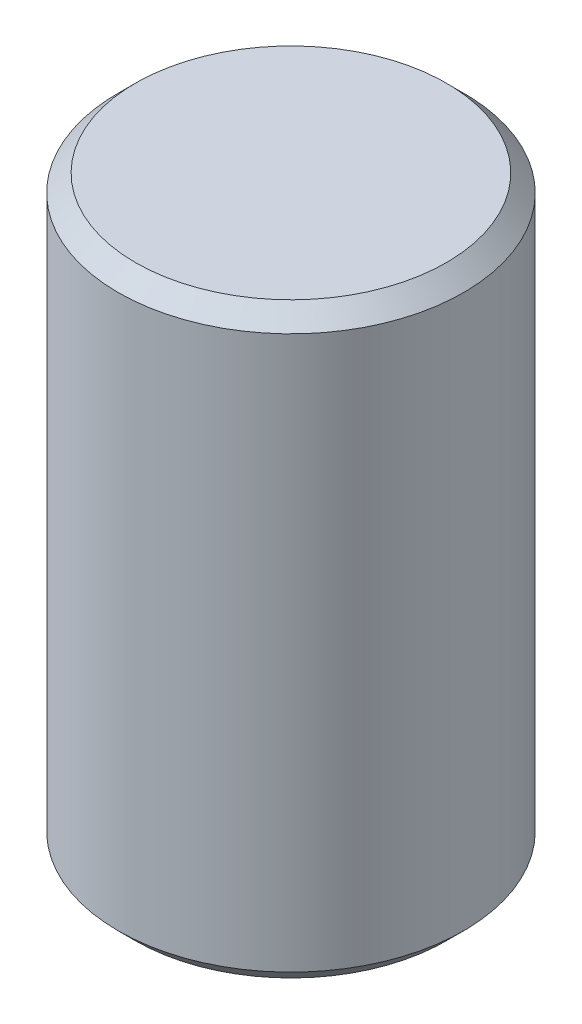
ISO-10303-21;
HEADER;
FILE_DESCRIPTION(('STEP AP214'),'2;1');
FILE_NAME('part.step','',(''),(''),'','','');
FILE_SCHEMA(('AUTOMOTIVE_DESIGN { 1 0 10303 214 1 1 1 1 }'));
ENDSEC;
DATA;
#1=APPLICATION_CONTEXT('core data for automotive mechanical design processes');
#2=APPLICATION_PROTOCOL_DEFINITION('international standard','automotive_design',2000,#1);
#3=PRODUCT_CONTEXT('',#1,'mechanical');
#4=PRODUCT('Part','Part','',(#3));
#5=PRODUCT_RELATED_PRODUCT_CATEGORY('part','',(#4));
#6=PRODUCT_DEFINITION_FORMATION('','',#4);
#7=PRODUCT_DEFINITION_CONTEXT('part definition',#1,'design');
#8=PRODUCT_DEFINITION('design','',#6,#7);
#9=PRODUCT_DEFINITION_SHAPE('','',#8);
#10=(LENGTH_UNIT() NAMED_UNIT(*) SI_UNIT(.MILLI.,.METRE.));
#11=(NAMED_UNIT(*) PLANE_ANGLE_UNIT() SI_UNIT($,.RADIAN.));
#12=(NAMED_UNIT(*) SI_UNIT($,.STERADIAN.) SOLID_ANGLE_UNIT());
#13=UNCERTAINTY_MEASURE_WITH_UNIT(LENGTH_MEASURE(1.E-05),#10,'distance_accuracy_value','');
#14=(GEOMETRIC_REPRESENTATION_CONTEXT(3) GLOBAL_UNCERTAINTY_ASSIGNED_CONTEXT((#13)) GLOBAL_UNIT_ASSIGNED_CONTEXT((#10,
#11,#12)) REPRESENTATION_CONTEXT('',''));
#15=CARTESIAN_POINT('',(0.,0.,0.));
#16=DIRECTION('',(0.,0.,1.));
#17=DIRECTION('',(1.,0.,0.));
#18=AXIS2_PLACEMENT_3D('',#15,#16,#17);
#19=CARTESIAN_POINT('',(0.,8.5,0.));
#20=DIRECTION('',(0.,-1.,0.));
#21=DIRECTION('',(0.,0.,-1.));
#22=AXIS2_PLACEMENT_3D('',#19,#20,#21);
#23=CYLINDRICAL_SURFACE('',#22,5.);
#24=CARTESIAN_POINT('',(0.,-8.,0.));
#25=DIRECTION('',(0.,1.,0.));
#26=DIRECTION('',(0.,0.,1.));
#27=AXIS2_PLACEMENT_3D('',#24,#25,#26);
#28=CIRCLE('',#27,5.);
#29=CARTESIAN_POINT('',(0.,-8.,5.));
#30=VERTEX_POINT('',#29);
#31=EDGE_CURVE('E53',#30,#30,#28,.T.);
#32=ORIENTED_EDGE('',*,*,#31,.T.);
#33=EDGE_LOOP('',(#32));
#34=FACE_BOUND('',#33,.T.);
#35=CARTESIAN_POINT('',(0.,7.99999999999999,0.));
#36=DIRECTION('',(0.,1.,0.));
#37=DIRECTION('',(0.,0.,1.));
#38=AXIS2_PLACEMENT_3D('',#35,#36,#37);
#39=CIRCLE('',#38,5.);
#40=CARTESIAN_POINT('',(0.,7.99999999999999,5.));
#41=VERTEX_POINT('',#40);
#42=EDGE_CURVE('E57',#41,#41,#39,.F.);
#43=ORIENTED_EDGE('',*,*,#42,.T.);
#44=EDGE_LOOP('',(#43));
#45=FACE_BOUND('',#44,.T.);
#46=ADVANCED_FACE('F41',(#34,#45),#23,.T.);
#47=CARTESIAN_POINT('',(0.,8.5,0.));
#48=DIRECTION('',(0.,1.,0.));
#49=DIRECTION('',(0.,0.,1.));
#50=AXIS2_PLACEMENT_3D('',#47,#48,#49);
#51=PLANE('',#50);
#52=CARTESIAN_POINT('',(0.,8.5,0.));
#53=DIRECTION('',(0.,1.,0.));
#54=DIRECTION('',(0.,0.,1.));
#55=AXIS2_PLACEMENT_3D('',#52,#53,#54);
#56=CIRCLE('',#55,4.5);
#57=CARTESIAN_POINT('',(0.,8.5,4.5));
#58=VERTEX_POINT('',#57);
#59=EDGE_CURVE('E10',#58,#58,#56,.T.);
#60=ORIENTED_EDGE('',*,*,#59,.T.);
#61=EDGE_LOOP('',(#60));
#62=FACE_BOUND('',#61,.T.);
#63=ADVANCED_FACE('F73',(#62),#51,.T.);
#64=CARTESIAN_POINT('',(0.,-8.5,0.));
#65=DIRECTION('',(0.,1.,0.));
#66=DIRECTION('',(0.,0.,1.));
#67=AXIS2_PLACEMENT_3D('',#64,#65,#66);
#68=PLANE('',#67);
#69=CARTESIAN_POINT('',(0.,-8.5,0.));
#70=DIRECTION('',(0.,1.,0.));
#71=DIRECTION('',(0.,0.,1.));
#72=AXIS2_PLACEMENT_3D('',#69,#70,#71);
#73=CIRCLE('',#72,4.5);
#74=CARTESIAN_POINT('',(0.,-8.5,4.5));
#75=VERTEX_POINT('',#74);
#76=EDGE_CURVE('E49',#75,#75,#73,.F.);
#77=ORIENTED_EDGE('',*,*,#76,.T.);
#78=EDGE_LOOP('',(#77));
#79=FACE_BOUND('',#78,.T.);
#80=ADVANCED_FACE('F70',(#79),#68,.F.);
#81=CARTESIAN_POINT('',(0.,-8.,0.));
#82=DIRECTION('',(0.,1.,0.));
#83=DIRECTION('',(0.,0.,1.));
#84=AXIS2_PLACEMENT_3D('',#81,#82,#83);
#85=CONICAL_SURFACE('',#84,5.,0.785398163397448);
#86=ORIENTED_EDGE('',*,*,#76,.F.);
#87=EDGE_LOOP('',(#86));
#88=FACE_BOUND('',#87,.T.);
#89=ORIENTED_EDGE('',*,*,#31,.F.);
#90=EDGE_LOOP('',(#89));
#91=FACE_BOUND('',#90,.T.);
#92=ADVANCED_FACE('F66',(#88,#91),#85,.T.);
#93=CARTESIAN_POINT('',(0.,8.5,0.));
#94=DIRECTION('',(0.,-1.,0.));
#95=DIRECTION('',(0.,0.,-1.));
#96=AXIS2_PLACEMENT_3D('',#93,#94,#95);
#97=CONICAL_SURFACE('',#96,4.5,0.785398163397445);
#98=ORIENTED_EDGE('',*,*,#42,.F.);
#99=EDGE_LOOP('',(#98));
#100=FACE_BOUND('',#99,.T.);
#101=ORIENTED_EDGE('',*,*,#59,.F.);
#102=EDGE_LOOP('',(#101));
#103=FACE_BOUND('',#102,.T.);
#104=ADVANCED_FACE('F44',(#100,#103),#97,.T.);
#105=CLOSED_SHELL('',(#46,#63,#80,#92,#104));
#106=MANIFOLD_SOLID_BREP('B2',#105);
#107=ADVANCED_BREP_SHAPE_REPRESENTATION('',(#18,#106),#14);
#108=SHAPE_DEFINITION_REPRESENTATION(#9,#107);
ENDSEC;
END-ISO-10303-21;
